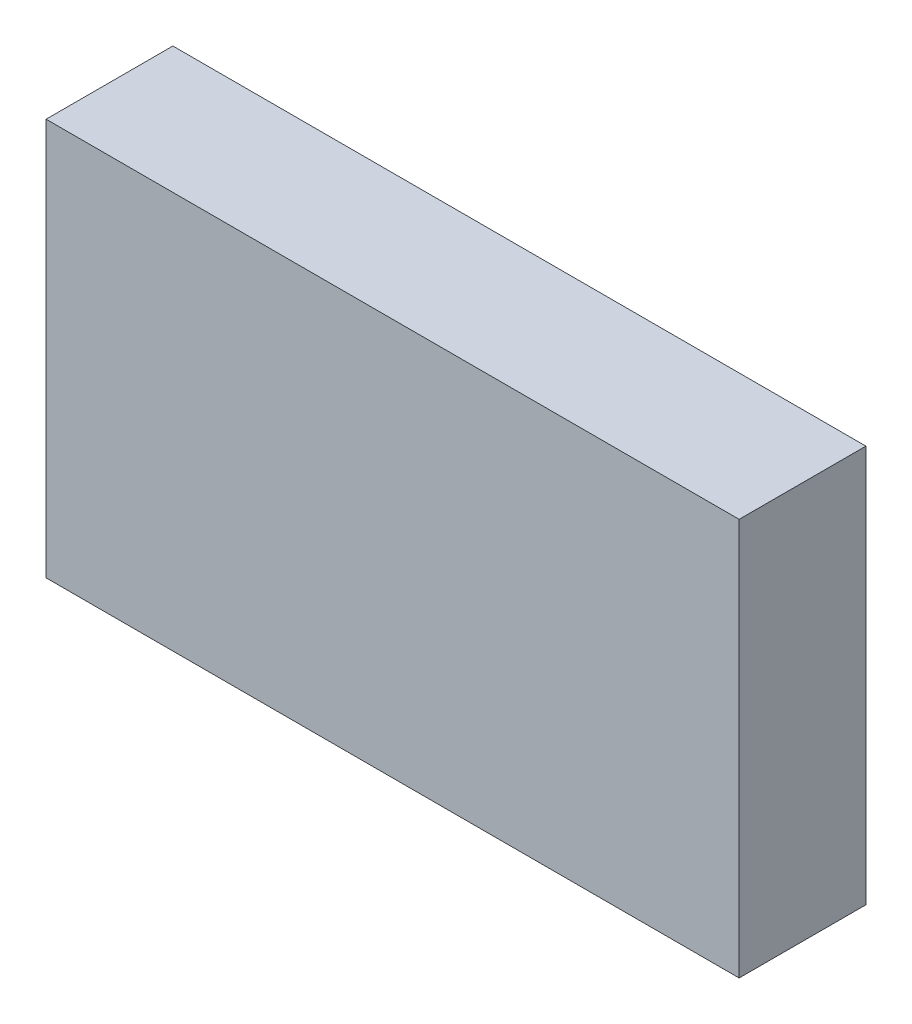
ISO-10303-21;
HEADER;
FILE_DESCRIPTION(('STEP AP214'),'2;1');
FILE_NAME('part.step','',(''),(''),'','','');
FILE_SCHEMA(('AUTOMOTIVE_DESIGN { 1 0 10303 214 1 1 1 1 }'));
ENDSEC;
DATA;
#1=APPLICATION_CONTEXT('core data for automotive mechanical design processes');
#2=APPLICATION_PROTOCOL_DEFINITION('international standard','automotive_design',2000,#1);
#3=PRODUCT_CONTEXT('',#1,'mechanical');
#4=PRODUCT('Part','Part','',(#3));
#5=PRODUCT_RELATED_PRODUCT_CATEGORY('part','',(#4));
#6=PRODUCT_DEFINITION_FORMATION('','',#4);
#7=PRODUCT_DEFINITION_CONTEXT('part definition',#1,'design');
#8=PRODUCT_DEFINITION('design','',#6,#7);
#9=PRODUCT_DEFINITION_SHAPE('','',#8);
#10=(LENGTH_UNIT() NAMED_UNIT(*) SI_UNIT(.MILLI.,.METRE.));
#11=(NAMED_UNIT(*) PLANE_ANGLE_UNIT() SI_UNIT($,.RADIAN.));
#12=(NAMED_UNIT(*) SI_UNIT($,.STERADIAN.) SOLID_ANGLE_UNIT());
#13=UNCERTAINTY_MEASURE_WITH_UNIT(LENGTH_MEASURE(1.E-05),#10,'distance_accuracy_value','');
#14=(GEOMETRIC_REPRESENTATION_CONTEXT(3) GLOBAL_UNCERTAINTY_ASSIGNED_CONTEXT((#13)) GLOBAL_UNIT_ASSIGNED_CONTEXT((#10,
#11,#12)) REPRESENTATION_CONTEXT('',''));
#15=CARTESIAN_POINT('',(0.,0.,0.));
#16=DIRECTION('',(0.,0.,1.));
#17=DIRECTION('',(1.,0.,0.));
#18=AXIS2_PLACEMENT_3D('',#15,#16,#17);
#19=CARTESIAN_POINT('',(0.,0.,3.));
#20=DIRECTION('',(1.,0.,0.));
#21=DIRECTION('',(0.,0.,-1.));
#22=AXIS2_PLACEMENT_3D('',#19,#20,#21);
#23=PLANE('',#22);
#24=DIRECTION('',(0.,-1.,0.));
#25=VECTOR('',#24,1.);
#26=CARTESIAN_POINT('',(0.,0.,0.));
#27=LINE('',#26,#25);
#28=CARTESIAN_POINT('',(0.,9.4,0.));
#29=VERTEX_POINT('',#28);
#30=CARTESIAN_POINT('',(0.,0.,0.));
#31=VERTEX_POINT('',#30);
#32=EDGE_CURVE('E110',#29,#31,#27,.T.);
#33=ORIENTED_EDGE('',*,*,#32,.T.);
#34=DIRECTION('',(0.,0.,-1.));
#35=VECTOR('',#34,1.);
#36=CARTESIAN_POINT('',(0.,0.,3.));
#37=LINE('',#36,#35);
#38=CARTESIAN_POINT('',(0.,0.,3.));
#39=VERTEX_POINT('',#38);
#40=EDGE_CURVE('E11',#39,#31,#37,.T.);
#41=ORIENTED_EDGE('',*,*,#40,.F.);
#42=DIRECTION('',(0.,-1.,0.));
#43=VECTOR('',#42,1.);
#44=CARTESIAN_POINT('',(0.,0.,3.));
#45=LINE('',#44,#43);
#46=CARTESIAN_POINT('',(0.,9.4,3.));
#47=VERTEX_POINT('',#46);
#48=EDGE_CURVE('E94',#47,#39,#45,.T.);
#49=ORIENTED_EDGE('',*,*,#48,.F.);
#50=DIRECTION('',(0.,0.,-1.));
#51=VECTOR('',#50,1.);
#52=CARTESIAN_POINT('',(0.,9.4,3.));
#53=LINE('',#52,#51);
#54=EDGE_CURVE('E106',#47,#29,#53,.T.);
#55=ORIENTED_EDGE('',*,*,#54,.T.);
#56=EDGE_LOOP('',(#33,#41,#49,#55));
#57=FACE_BOUND('',#56,.T.);
#58=ADVANCED_FACE('F42',(#57),#23,.F.);
#59=CARTESIAN_POINT('',(0.,0.,3.));
#60=DIRECTION('',(0.,1.,0.));
#61=DIRECTION('',(0.,0.,1.));
#62=AXIS2_PLACEMENT_3D('',#59,#60,#61);
#63=PLANE('',#62);
#64=DIRECTION('',(1.,0.,0.));
#65=VECTOR('',#64,1.);
#66=CARTESIAN_POINT('',(0.,0.,0.));
#67=LINE('',#66,#65);
#68=CARTESIAN_POINT('',(16.4,0.,0.));
#69=VERTEX_POINT('',#68);
#70=EDGE_CURVE('E99',#31,#69,#67,.T.);
#71=ORIENTED_EDGE('',*,*,#70,.T.);
#72=DIRECTION('',(0.,0.,-1.));
#73=VECTOR('',#72,1.);
#74=CARTESIAN_POINT('',(16.4,0.,3.));
#75=LINE('',#74,#73);
#76=CARTESIAN_POINT('',(16.4,0.,3.));
#77=VERTEX_POINT('',#76);
#78=EDGE_CURVE('E51',#77,#69,#75,.T.);
#79=ORIENTED_EDGE('',*,*,#78,.F.);
#80=DIRECTION('',(1.,0.,0.));
#81=VECTOR('',#80,1.);
#82=CARTESIAN_POINT('',(0.,0.,3.));
#83=LINE('',#82,#81);
#84=EDGE_CURVE('E89',#39,#77,#83,.T.);
#85=ORIENTED_EDGE('',*,*,#84,.F.);
#86=ORIENTED_EDGE('',*,*,#40,.T.);
#87=EDGE_LOOP('',(#71,#79,#85,#86));
#88=FACE_BOUND('',#87,.T.);
#89=ADVANCED_FACE('F98',(#88),#63,.F.);
#90=CARTESIAN_POINT('',(16.4,0.,3.));
#91=DIRECTION('',(-1.,0.,0.));
#92=DIRECTION('',(0.,0.,1.));
#93=AXIS2_PLACEMENT_3D('',#90,#91,#92);
#94=PLANE('',#93);
#95=DIRECTION('',(0.,1.,0.));
#96=VECTOR('',#95,1.);
#97=CARTESIAN_POINT('',(16.4,0.,0.));
#98=LINE('',#97,#96);
#99=CARTESIAN_POINT('',(16.4,9.4,0.));
#100=VERTEX_POINT('',#99);
#101=EDGE_CURVE('E76',#69,#100,#98,.T.);
#102=ORIENTED_EDGE('',*,*,#101,.T.);
#103=DIRECTION('',(0.,0.,-1.));
#104=VECTOR('',#103,1.);
#105=CARTESIAN_POINT('',(16.4,9.4,3.));
#106=LINE('',#105,#104);
#107=CARTESIAN_POINT('',(16.4,9.4,3.));
#108=VERTEX_POINT('',#107);
#109=EDGE_CURVE('E101',#108,#100,#106,.T.);
#110=ORIENTED_EDGE('',*,*,#109,.F.);
#111=DIRECTION('',(0.,1.,0.));
#112=VECTOR('',#111,1.);
#113=CARTESIAN_POINT('',(16.4,0.,3.));
#114=LINE('',#113,#112);
#115=EDGE_CURVE('E92',#77,#108,#114,.T.);
#116=ORIENTED_EDGE('',*,*,#115,.F.);
#117=ORIENTED_EDGE('',*,*,#78,.T.);
#118=EDGE_LOOP('',(#102,#110,#116,#117));
#119=FACE_BOUND('',#118,.T.);
#120=ADVANCED_FACE('F102',(#119),#94,.F.);
#121=CARTESIAN_POINT('',(0.,9.4,3.));
#122=DIRECTION('',(0.,-1.,0.));
#123=DIRECTION('',(0.,0.,-1.));
#124=AXIS2_PLACEMENT_3D('',#121,#122,#123);
#125=PLANE('',#124);
#126=DIRECTION('',(-1.,0.,0.));
#127=VECTOR('',#126,1.);
#128=CARTESIAN_POINT('',(0.,9.4,0.));
#129=LINE('',#128,#127);
#130=EDGE_CURVE('E82',#100,#29,#129,.T.);
#131=ORIENTED_EDGE('',*,*,#130,.T.);
#132=ORIENTED_EDGE('',*,*,#54,.F.);
#133=DIRECTION('',(-1.,0.,0.));
#134=VECTOR('',#133,1.);
#135=CARTESIAN_POINT('',(0.,9.4,3.));
#136=LINE('',#135,#134);
#137=EDGE_CURVE('E59',#108,#47,#136,.T.);
#138=ORIENTED_EDGE('',*,*,#137,.F.);
#139=ORIENTED_EDGE('',*,*,#109,.T.);
#140=EDGE_LOOP('',(#131,#132,#138,#139));
#141=FACE_BOUND('',#140,.T.);
#142=ADVANCED_FACE('F123',(#141),#125,.F.);
#143=CARTESIAN_POINT('',(0.,0.,3.));
#144=DIRECTION('',(0.,0.,-1.));
#145=DIRECTION('',(-1.,0.,0.));
#146=AXIS2_PLACEMENT_3D('',#143,#144,#145);
#147=PLANE('',#146);
#148=ORIENTED_EDGE('',*,*,#48,.T.);
#149=ORIENTED_EDGE('',*,*,#84,.T.);
#150=ORIENTED_EDGE('',*,*,#115,.T.);
#151=ORIENTED_EDGE('',*,*,#137,.T.);
#152=EDGE_LOOP('',(#148,#149,#150,#151));
#153=FACE_BOUND('',#152,.T.);
#154=ADVANCED_FACE('F90',(#153),#147,.F.);
#155=CARTESIAN_POINT('',(0.,0.,0.));
#156=DIRECTION('',(0.,0.,-1.));
#157=DIRECTION('',(-1.,0.,0.));
#158=AXIS2_PLACEMENT_3D('',#155,#156,#157);
#159=PLANE('',#158);
#160=ORIENTED_EDGE('',*,*,#32,.F.);
#161=ORIENTED_EDGE('',*,*,#130,.F.);
#162=ORIENTED_EDGE('',*,*,#101,.F.);
#163=ORIENTED_EDGE('',*,*,#70,.F.);
#164=EDGE_LOOP('',(#160,#161,#162,#163));
#165=FACE_BOUND('',#164,.T.);
#166=ADVANCED_FACE('F126',(#165),#159,.T.);
#167=CLOSED_SHELL('',(#58,#89,#120,#142,#154,#166));
#168=MANIFOLD_SOLID_BREP('B2',#167);
#169=ADVANCED_BREP_SHAPE_REPRESENTATION('',(#18,#168),#14);
#170=SHAPE_DEFINITION_REPRESENTATION(#9,#169);
ENDSEC;
END-ISO-10303-21;
